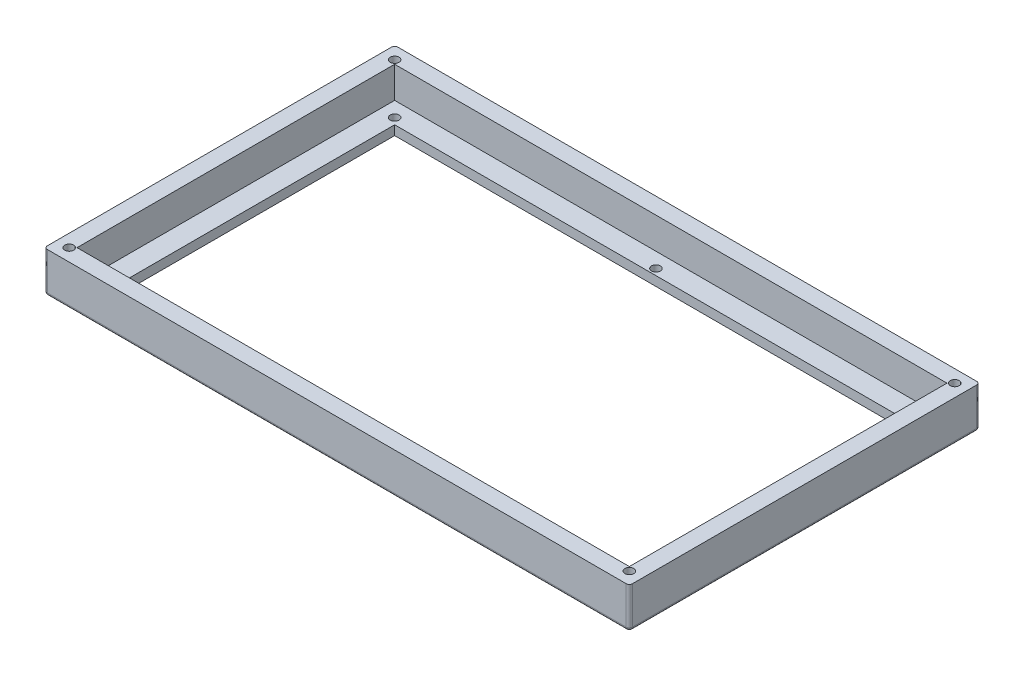
ISO-10303-21;
HEADER;
FILE_DESCRIPTION(('STEP AP214'),'2;1');
FILE_NAME('part.step','',(''),(''),'','','');
FILE_SCHEMA(('AUTOMOTIVE_DESIGN { 1 0 10303 214 1 1 1 1 }'));
ENDSEC;
DATA;
#1=APPLICATION_CONTEXT('core data for automotive mechanical design processes');
#2=APPLICATION_PROTOCOL_DEFINITION('international standard','automotive_design',2000,#1);
#3=PRODUCT_CONTEXT('',#1,'mechanical');
#4=PRODUCT('Part','Part','',(#3));
#5=PRODUCT_RELATED_PRODUCT_CATEGORY('part','',(#4));
#6=PRODUCT_DEFINITION_FORMATION('','',#4);
#7=PRODUCT_DEFINITION_CONTEXT('part definition',#1,'design');
#8=PRODUCT_DEFINITION('design','',#6,#7);
#9=PRODUCT_DEFINITION_SHAPE('','',#8);
#10=(LENGTH_UNIT() NAMED_UNIT(*) SI_UNIT(.MILLI.,.METRE.));
#11=(NAMED_UNIT(*) PLANE_ANGLE_UNIT() SI_UNIT($,.RADIAN.));
#12=(NAMED_UNIT(*) SI_UNIT($,.STERADIAN.) SOLID_ANGLE_UNIT());
#13=UNCERTAINTY_MEASURE_WITH_UNIT(LENGTH_MEASURE(1.E-05),#10,'distance_accuracy_value','');
#14=(GEOMETRIC_REPRESENTATION_CONTEXT(3) GLOBAL_UNCERTAINTY_ASSIGNED_CONTEXT((#13)) GLOBAL_UNIT_ASSIGNED_CONTEXT((#10,
#11,#12)) REPRESENTATION_CONTEXT('',''));
#15=CARTESIAN_POINT('',(0.,0.,0.));
#16=DIRECTION('',(0.,0.,1.));
#17=DIRECTION('',(1.,0.,0.));
#18=AXIS2_PLACEMENT_3D('',#15,#16,#17);
#19=CARTESIAN_POINT('',(0.,3.,0.));
#20=DIRECTION('',(0.,1.,0.));
#21=DIRECTION('',(0.,0.,1.));
#22=AXIS2_PLACEMENT_3D('',#19,#20,#21);
#23=PLANE('',#22);
#24=CARTESIAN_POINT('',(83.4999999999997,3.,-46.));
#25=DIRECTION('',(0.,1.,0.));
#26=DIRECTION('',(0.,0.,1.));
#27=AXIS2_PLACEMENT_3D('',#24,#25,#26);
#28=CIRCLE('',#27,1.425);
#29=CARTESIAN_POINT('',(83.4999999999997,3.,-44.575));
#30=VERTEX_POINT('',#29);
#31=EDGE_CURVE('E234',#30,#30,#28,.T.);
#32=ORIENTED_EDGE('',*,*,#31,.F.);
#33=EDGE_LOOP('',(#32));
#34=FACE_BOUND('',#33,.T.);
#35=CARTESIAN_POINT('',(83.5,3.,46.));
#36=DIRECTION('',(0.,1.,0.));
#37=DIRECTION('',(0.,0.,1.));
#38=AXIS2_PLACEMENT_3D('',#35,#36,#37);
#39=CIRCLE('',#38,1.425);
#40=CARTESIAN_POINT('',(83.5,3.,47.425));
#41=VERTEX_POINT('',#40);
#42=EDGE_CURVE('E246',#41,#41,#39,.T.);
#43=ORIENTED_EDGE('',*,*,#42,.F.);
#44=EDGE_LOOP('',(#43));
#45=FACE_BOUND('',#44,.T.);
#46=CARTESIAN_POINT('',(-83.5,3.,46.));
#47=DIRECTION('',(0.,1.,0.));
#48=DIRECTION('',(0.,0.,1.));
#49=AXIS2_PLACEMENT_3D('',#46,#47,#48);
#50=CIRCLE('',#49,1.425);
#51=CARTESIAN_POINT('',(-83.5,3.,47.425));
#52=VERTEX_POINT('',#51);
#53=EDGE_CURVE('E258',#52,#52,#50,.T.);
#54=ORIENTED_EDGE('',*,*,#53,.F.);
#55=EDGE_LOOP('',(#54));
#56=FACE_BOUND('',#55,.T.);
#57=DIRECTION('',(1.,0.,0.));
#58=VECTOR('',#57,1.);
#59=CARTESIAN_POINT('',(-81.5,3.,44.));
#60=LINE('',#59,#58);
#61=CARTESIAN_POINT('',(-81.5,3.,44.));
#62=VERTEX_POINT('',#61);
#63=CARTESIAN_POINT('',(81.5,3.,44.));
#64=VERTEX_POINT('',#63);
#65=EDGE_CURVE('E269',#62,#64,#60,.T.);
#66=ORIENTED_EDGE('',*,*,#65,.F.);
#67=DIRECTION('',(0.,0.,1.));
#68=VECTOR('',#67,1.);
#69=CARTESIAN_POINT('',(-81.5,3.,-44.));
#70=LINE('',#69,#68);
#71=CARTESIAN_POINT('',(-81.5,3.,-44.));
#72=VERTEX_POINT('',#71);
#73=EDGE_CURVE('E267',#72,#62,#70,.T.);
#74=ORIENTED_EDGE('',*,*,#73,.F.);
#75=DIRECTION('',(-1.,0.,0.));
#76=VECTOR('',#75,1.);
#77=CARTESIAN_POINT('',(-81.5,3.,-44.));
#78=LINE('',#77,#76);
#79=CARTESIAN_POINT('',(81.5,3.,-44.));
#80=VERTEX_POINT('',#79);
#81=EDGE_CURVE('E275',#80,#72,#78,.T.);
#82=ORIENTED_EDGE('',*,*,#81,.F.);
#83=DIRECTION('',(0.,0.,-1.));
#84=VECTOR('',#83,1.);
#85=CARTESIAN_POINT('',(81.5,3.,-44.));
#86=LINE('',#85,#84);
#87=EDGE_CURVE('E272',#64,#80,#86,.T.);
#88=ORIENTED_EDGE('',*,*,#87,.F.);
#89=EDGE_LOOP('',(#66,#74,#82,#88));
#90=FACE_BOUND('',#89,.T.);
#91=CARTESIAN_POINT('',(0.,3.,46.));
#92=DIRECTION('',(0.,1.,0.));
#93=DIRECTION('',(0.,0.,1.));
#94=AXIS2_PLACEMENT_3D('',#91,#92,#93);
#95=CIRCLE('',#94,1.425);
#96=CARTESIAN_POINT('',(0.,3.,47.425));
#97=VERTEX_POINT('',#96);
#98=EDGE_CURVE('E252',#97,#97,#95,.T.);
#99=ORIENTED_EDGE('',*,*,#98,.F.);
#100=EDGE_LOOP('',(#99));
#101=FACE_BOUND('',#100,.T.);
#102=CARTESIAN_POINT('',(-3.05311331771918E-13,3.,-46.));
#103=DIRECTION('',(0.,1.,0.));
#104=DIRECTION('',(0.,0.,1.));
#105=AXIS2_PLACEMENT_3D('',#102,#103,#104);
#106=CIRCLE('',#105,1.425);
#107=CARTESIAN_POINT('',(-3.05311331771918E-13,3.,-44.575));
#108=VERTEX_POINT('',#107);
#109=EDGE_CURVE('E240',#108,#108,#106,.T.);
#110=ORIENTED_EDGE('',*,*,#109,.F.);
#111=EDGE_LOOP('',(#110));
#112=FACE_BOUND('',#111,.T.);
#113=CARTESIAN_POINT('',(-83.5000000000003,3.,-46.));
#114=DIRECTION('',(0.,1.,0.));
#115=DIRECTION('',(0.,0.,1.));
#116=AXIS2_PLACEMENT_3D('',#113,#114,#115);
#117=CIRCLE('',#116,1.425);
#118=CARTESIAN_POINT('',(-83.5000000000003,3.,-44.575));
#119=VERTEX_POINT('',#118);
#120=EDGE_CURVE('E228',#119,#119,#117,.T.);
#121=ORIENTED_EDGE('',*,*,#120,.F.);
#122=EDGE_LOOP('',(#121));
#123=FACE_BOUND('',#122,.T.);
#124=DIRECTION('',(-1.,0.,0.));
#125=VECTOR('',#124,1.);
#126=CARTESIAN_POINT('',(-88.25,3.,-50.75));
#127=LINE('',#126,#125);
#128=CARTESIAN_POINT('',(88.25,3.,-50.75));
#129=VERTEX_POINT('',#128);
#130=CARTESIAN_POINT('',(-88.25,3.,-50.75));
#131=VERTEX_POINT('',#130);
#132=EDGE_CURVE('E173',#129,#131,#127,.T.);
#133=ORIENTED_EDGE('',*,*,#132,.T.);
#134=DIRECTION('',(0.,0.,1.));
#135=VECTOR('',#134,1.);
#136=CARTESIAN_POINT('',(-88.25,3.,-50.75));
#137=LINE('',#136,#135);
#138=CARTESIAN_POINT('',(-88.25,3.,50.75));
#139=VERTEX_POINT('',#138);
#140=EDGE_CURVE('E194',#131,#139,#137,.T.);
#141=ORIENTED_EDGE('',*,*,#140,.T.);
#142=DIRECTION('',(1.,0.,0.));
#143=VECTOR('',#142,1.);
#144=CARTESIAN_POINT('',(-88.25,3.,50.75));
#145=LINE('',#144,#143);
#146=CARTESIAN_POINT('',(88.25,3.,50.75));
#147=VERTEX_POINT('',#146);
#148=EDGE_CURVE('E179',#139,#147,#145,.T.);
#149=ORIENTED_EDGE('',*,*,#148,.T.);
#150=DIRECTION('',(0.,0.,-1.));
#151=VECTOR('',#150,1.);
#152=CARTESIAN_POINT('',(88.25,3.,-50.75));
#153=LINE('',#152,#151);
#154=EDGE_CURVE('E198',#147,#129,#153,.T.);
#155=ORIENTED_EDGE('',*,*,#154,.T.);
#156=EDGE_LOOP('',(#133,#141,#149,#155));
#157=FACE_BOUND('',#156,.T.);
#158=ADVANCED_FACE('F37',(#34,#45,#56,#90,#101,#112,#123,#157),#23,.T.);
#159=CARTESIAN_POINT('',(0.,0.,0.));
#160=DIRECTION('',(0.,1.,0.));
#161=DIRECTION('',(0.,0.,1.));
#162=AXIS2_PLACEMENT_3D('',#159,#160,#161);
#163=PLANE('',#162);
#164=DIRECTION('',(0.,0.,-1.));
#165=VECTOR('',#164,1.);
#166=CARTESIAN_POINT('',(92.5,0.,0.));
#167=LINE('',#166,#165);
#168=CARTESIAN_POINT('',(92.5,0.,-55.));
#169=VERTEX_POINT('',#168);
#170=CARTESIAN_POINT('',(92.5,0.,55.));
#171=VERTEX_POINT('',#170);
#172=EDGE_CURVE('E308',#169,#171,#167,.F.);
#173=ORIENTED_EDGE('',*,*,#172,.T.);
#174=DIRECTION('',(1.,0.,0.));
#175=VECTOR('',#174,1.);
#176=CARTESIAN_POINT('',(0.,0.,55.));
#177=LINE('',#176,#175);
#178=CARTESIAN_POINT('',(-92.5,0.,55.));
#179=VERTEX_POINT('',#178);
#180=EDGE_CURVE('E310',#171,#179,#177,.F.);
#181=ORIENTED_EDGE('',*,*,#180,.T.);
#182=DIRECTION('',(0.,0.,1.));
#183=VECTOR('',#182,1.);
#184=CARTESIAN_POINT('',(-92.5,0.,0.));
#185=LINE('',#184,#183);
#186=CARTESIAN_POINT('',(-92.5,0.,-55.));
#187=VERTEX_POINT('',#186);
#188=EDGE_CURVE('E304',#179,#187,#185,.F.);
#189=ORIENTED_EDGE('',*,*,#188,.T.);
#190=DIRECTION('',(-1.,0.,0.));
#191=VECTOR('',#190,1.);
#192=CARTESIAN_POINT('',(0.,0.,-55.));
#193=LINE('',#192,#191);
#194=EDGE_CURVE('E306',#187,#169,#193,.F.);
#195=ORIENTED_EDGE('',*,*,#194,.T.);
#196=EDGE_LOOP('',(#173,#181,#189,#195));
#197=FACE_BOUND('',#196,.T.);
#198=DIRECTION('',(0.,0.,1.));
#199=VECTOR('',#198,1.);
#200=CARTESIAN_POINT('',(-81.5,0.,-44.));
#201=LINE('',#200,#199);
#202=CARTESIAN_POINT('',(-81.5,0.,-44.));
#203=VERTEX_POINT('',#202);
#204=CARTESIAN_POINT('',(-81.5,0.,44.));
#205=VERTEX_POINT('',#204);
#206=EDGE_CURVE('E266',#203,#205,#201,.T.);
#207=ORIENTED_EDGE('',*,*,#206,.T.);
#208=DIRECTION('',(1.,0.,0.));
#209=VECTOR('',#208,1.);
#210=CARTESIAN_POINT('',(-81.5,0.,44.));
#211=LINE('',#210,#209);
#212=CARTESIAN_POINT('',(81.5,0.,44.));
#213=VERTEX_POINT('',#212);
#214=EDGE_CURVE('E280',#205,#213,#211,.T.);
#215=ORIENTED_EDGE('',*,*,#214,.T.);
#216=DIRECTION('',(0.,0.,-1.));
#217=VECTOR('',#216,1.);
#218=CARTESIAN_POINT('',(81.5,0.,-44.));
#219=LINE('',#218,#217);
#220=CARTESIAN_POINT('',(81.5,0.,-44.));
#221=VERTEX_POINT('',#220);
#222=EDGE_CURVE('E283',#213,#221,#219,.T.);
#223=ORIENTED_EDGE('',*,*,#222,.T.);
#224=DIRECTION('',(-1.,0.,0.));
#225=VECTOR('',#224,1.);
#226=CARTESIAN_POINT('',(-81.5,0.,-44.));
#227=LINE('',#226,#225);
#228=EDGE_CURVE('E270',#221,#203,#227,.T.);
#229=ORIENTED_EDGE('',*,*,#228,.T.);
#230=EDGE_LOOP('',(#207,#215,#223,#229));
#231=FACE_BOUND('',#230,.T.);
#232=CARTESIAN_POINT('',(-89.5,0.,52.));
#233=DIRECTION('',(0.,1.,0.));
#234=DIRECTION('',(0.,0.,1.));
#235=AXIS2_PLACEMENT_3D('',#232,#233,#234);
#236=CIRCLE('',#235,1.425);
#237=CARTESIAN_POINT('',(-89.5,0.,53.425));
#238=VERTEX_POINT('',#237);
#239=EDGE_CURVE('E261',#238,#238,#236,.T.);
#240=ORIENTED_EDGE('',*,*,#239,.T.);
#241=EDGE_LOOP('',(#240));
#242=FACE_BOUND('',#241,.T.);
#243=CARTESIAN_POINT('',(-83.5,0.,46.));
#244=DIRECTION('',(0.,1.,0.));
#245=DIRECTION('',(0.,0.,1.));
#246=AXIS2_PLACEMENT_3D('',#243,#244,#245);
#247=CIRCLE('',#246,1.425);
#248=CARTESIAN_POINT('',(-83.5,0.,47.425));
#249=VERTEX_POINT('',#248);
#250=EDGE_CURVE('E255',#249,#249,#247,.T.);
#251=ORIENTED_EDGE('',*,*,#250,.T.);
#252=EDGE_LOOP('',(#251));
#253=FACE_BOUND('',#252,.T.);
#254=CARTESIAN_POINT('',(0.,0.,46.));
#255=DIRECTION('',(0.,1.,0.));
#256=DIRECTION('',(0.,0.,1.));
#257=AXIS2_PLACEMENT_3D('',#254,#255,#256);
#258=CIRCLE('',#257,1.425);
#259=CARTESIAN_POINT('',(0.,0.,47.425));
#260=VERTEX_POINT('',#259);
#261=EDGE_CURVE('E249',#260,#260,#258,.T.);
#262=ORIENTED_EDGE('',*,*,#261,.T.);
#263=EDGE_LOOP('',(#262));
#264=FACE_BOUND('',#263,.T.);
#265=CARTESIAN_POINT('',(83.5,0.,46.));
#266=DIRECTION('',(0.,1.,0.));
#267=DIRECTION('',(0.,0.,1.));
#268=AXIS2_PLACEMENT_3D('',#265,#266,#267);
#269=CIRCLE('',#268,1.425);
#270=CARTESIAN_POINT('',(83.5,0.,47.425));
#271=VERTEX_POINT('',#270);
#272=EDGE_CURVE('E243',#271,#271,#269,.T.);
#273=ORIENTED_EDGE('',*,*,#272,.T.);
#274=EDGE_LOOP('',(#273));
#275=FACE_BOUND('',#274,.T.);
#276=CARTESIAN_POINT('',(-3.05311331771918E-13,0.,-46.));
#277=DIRECTION('',(0.,1.,0.));
#278=DIRECTION('',(0.,0.,1.));
#279=AXIS2_PLACEMENT_3D('',#276,#277,#278);
#280=CIRCLE('',#279,1.425);
#281=CARTESIAN_POINT('',(-3.05311331771918E-13,0.,-44.575));
#282=VERTEX_POINT('',#281);
#283=EDGE_CURVE('E237',#282,#282,#280,.T.);
#284=ORIENTED_EDGE('',*,*,#283,.T.);
#285=EDGE_LOOP('',(#284));
#286=FACE_BOUND('',#285,.T.);
#287=CARTESIAN_POINT('',(83.4999999999997,0.,-46.));
#288=DIRECTION('',(0.,1.,0.));
#289=DIRECTION('',(0.,0.,1.));
#290=AXIS2_PLACEMENT_3D('',#287,#288,#289);
#291=CIRCLE('',#290,1.425);
#292=CARTESIAN_POINT('',(83.4999999999997,0.,-44.575));
#293=VERTEX_POINT('',#292);
#294=EDGE_CURVE('E231',#293,#293,#291,.T.);
#295=ORIENTED_EDGE('',*,*,#294,.T.);
#296=EDGE_LOOP('',(#295));
#297=FACE_BOUND('',#296,.T.);
#298=CARTESIAN_POINT('',(-83.5000000000003,0.,-46.));
#299=DIRECTION('',(0.,1.,0.));
#300=DIRECTION('',(0.,0.,1.));
#301=AXIS2_PLACEMENT_3D('',#298,#299,#300);
#302=CIRCLE('',#301,1.425);
#303=CARTESIAN_POINT('',(-83.5000000000003,0.,-44.575));
#304=VERTEX_POINT('',#303);
#305=EDGE_CURVE('E227',#304,#304,#302,.T.);
#306=ORIENTED_EDGE('',*,*,#305,.T.);
#307=EDGE_LOOP('',(#306));
#308=FACE_BOUND('',#307,.T.);
#309=CARTESIAN_POINT('',(89.5,0.,52.));
#310=DIRECTION('',(0.,1.,0.));
#311=DIRECTION('',(0.,0.,1.));
#312=AXIS2_PLACEMENT_3D('',#309,#310,#311);
#313=CIRCLE('',#312,1.425);
#314=CARTESIAN_POINT('',(89.5,0.,53.425));
#315=VERTEX_POINT('',#314);
#316=EDGE_CURVE('E224',#315,#315,#313,.T.);
#317=ORIENTED_EDGE('',*,*,#316,.T.);
#318=EDGE_LOOP('',(#317));
#319=FACE_BOUND('',#318,.T.);
#320=CARTESIAN_POINT('',(89.4999999999996,0.,-52.));
#321=DIRECTION('',(0.,1.,0.));
#322=DIRECTION('',(0.,0.,1.));
#323=AXIS2_PLACEMENT_3D('',#320,#321,#322);
#324=CIRCLE('',#323,1.425);
#325=CARTESIAN_POINT('',(89.4999999999996,0.,-50.575));
#326=VERTEX_POINT('',#325);
#327=EDGE_CURVE('E221',#326,#326,#324,.T.);
#328=ORIENTED_EDGE('',*,*,#327,.T.);
#329=EDGE_LOOP('',(#328));
#330=FACE_BOUND('',#329,.T.);
#331=CARTESIAN_POINT('',(-89.5000000000003,0.,-52.));
#332=DIRECTION('',(0.,1.,0.));
#333=DIRECTION('',(0.,0.,1.));
#334=AXIS2_PLACEMENT_3D('',#331,#332,#333);
#335=CIRCLE('',#334,1.425);
#336=CARTESIAN_POINT('',(-89.5000000000003,0.,-50.575));
#337=VERTEX_POINT('',#336);
#338=EDGE_CURVE('E218',#337,#337,#335,.T.);
#339=ORIENTED_EDGE('',*,*,#338,.T.);
#340=EDGE_LOOP('',(#339));
#341=FACE_BOUND('',#340,.T.);
#342=ADVANCED_FACE('F430',(#197,#231,#242,#253,#264,#275,#286,#297,#308,#319,#330,#341),#163,.F.);
#343=CARTESIAN_POINT('',(-93.5,3.,-56.));
#344=DIRECTION('',(1.,0.,0.));
#345=DIRECTION('',(0.,0.,-1.));
#346=AXIS2_PLACEMENT_3D('',#343,#344,#345);
#347=PLANE('',#346);
#348=DIRECTION('',(0.,0.,1.));
#349=VECTOR('',#348,1.);
#350=CARTESIAN_POINT('',(-93.5,13.,-56.));
#351=LINE('',#350,#349);
#352=CARTESIAN_POINT('',(-93.5,13.,-55.));
#353=VERTEX_POINT('',#352);
#354=CARTESIAN_POINT('',(-93.5,13.,55.));
#355=VERTEX_POINT('',#354);
#356=EDGE_CURVE('E180',#353,#355,#351,.T.);
#357=ORIENTED_EDGE('',*,*,#356,.F.);
#358=DIRECTION('',(0.,-1.,0.));
#359=VECTOR('',#358,1.);
#360=CARTESIAN_POINT('',(-93.5,3.,-55.));
#361=LINE('',#360,#359);
#362=CARTESIAN_POINT('',(-93.5,1.,-55.));
#363=VERTEX_POINT('',#362);
#364=EDGE_CURVE('E11',#353,#363,#361,.T.);
#365=ORIENTED_EDGE('',*,*,#364,.T.);
#366=DIRECTION('',(0.,0.,1.));
#367=VECTOR('',#366,1.);
#368=CARTESIAN_POINT('',(-93.5,1.,-56.));
#369=LINE('',#368,#367);
#370=CARTESIAN_POINT('',(-93.5,1.,55.));
#371=VERTEX_POINT('',#370);
#372=EDGE_CURVE('E46',#363,#371,#369,.T.);
#373=ORIENTED_EDGE('',*,*,#372,.T.);
#374=DIRECTION('',(0.,-1.,0.));
#375=VECTOR('',#374,1.);
#376=CARTESIAN_POINT('',(-93.5,3.,55.));
#377=LINE('',#376,#375);
#378=EDGE_CURVE('E333',#371,#355,#377,.F.);
#379=ORIENTED_EDGE('',*,*,#378,.T.);
#380=EDGE_LOOP('',(#357,#365,#373,#379));
#381=FACE_BOUND('',#380,.T.);
#382=ADVANCED_FACE('F452',(#381),#347,.F.);
#383=CARTESIAN_POINT('',(-93.5,3.,56.));
#384=DIRECTION('',(0.,0.,-1.));
#385=DIRECTION('',(-1.,0.,0.));
#386=AXIS2_PLACEMENT_3D('',#383,#384,#385);
#387=PLANE('',#386);
#388=DIRECTION('',(1.,0.,0.));
#389=VECTOR('',#388,1.);
#390=CARTESIAN_POINT('',(-93.5,1.,56.));
#391=LINE('',#390,#389);
#392=CARTESIAN_POINT('',(-92.5,1.,56.));
#393=VERTEX_POINT('',#392);
#394=CARTESIAN_POINT('',(92.5,1.,56.));
#395=VERTEX_POINT('',#394);
#396=EDGE_CURVE('E299',#393,#395,#391,.T.);
#397=ORIENTED_EDGE('',*,*,#396,.T.);
#398=DIRECTION('',(0.,-1.,0.));
#399=VECTOR('',#398,1.);
#400=CARTESIAN_POINT('',(92.5,3.,56.));
#401=LINE('',#400,#399);
#402=CARTESIAN_POINT('',(92.5,13.,56.));
#403=VERTEX_POINT('',#402);
#404=EDGE_CURVE('E302',#395,#403,#401,.F.);
#405=ORIENTED_EDGE('',*,*,#404,.T.);
#406=DIRECTION('',(1.,0.,0.));
#407=VECTOR('',#406,1.);
#408=CARTESIAN_POINT('',(-93.5,13.,56.));
#409=LINE('',#408,#407);
#410=CARTESIAN_POINT('',(-92.5,13.,56.));
#411=VERTEX_POINT('',#410);
#412=EDGE_CURVE('E209',#411,#403,#409,.T.);
#413=ORIENTED_EDGE('',*,*,#412,.F.);
#414=DIRECTION('',(0.,-1.,0.));
#415=VECTOR('',#414,1.);
#416=CARTESIAN_POINT('',(-92.5,3.,56.));
#417=LINE('',#416,#415);
#418=EDGE_CURVE('E297',#411,#393,#417,.T.);
#419=ORIENTED_EDGE('',*,*,#418,.T.);
#420=EDGE_LOOP('',(#397,#405,#413,#419));
#421=FACE_BOUND('',#420,.T.);
#422=ADVANCED_FACE('F464',(#421),#387,.F.);
#423=CARTESIAN_POINT('',(93.5,3.,-56.));
#424=DIRECTION('',(-1.,0.,0.));
#425=DIRECTION('',(0.,0.,1.));
#426=AXIS2_PLACEMENT_3D('',#423,#424,#425);
#427=PLANE('',#426);
#428=DIRECTION('',(0.,0.,-1.));
#429=VECTOR('',#428,1.);
#430=CARTESIAN_POINT('',(93.5,13.,-56.));
#431=LINE('',#430,#429);
#432=CARTESIAN_POINT('',(93.5,13.,55.));
#433=VERTEX_POINT('',#432);
#434=CARTESIAN_POINT('',(93.5,13.,-55.));
#435=VERTEX_POINT('',#434);
#436=EDGE_CURVE('E212',#433,#435,#431,.T.);
#437=ORIENTED_EDGE('',*,*,#436,.F.);
#438=DIRECTION('',(0.,-1.,0.));
#439=VECTOR('',#438,1.);
#440=CARTESIAN_POINT('',(93.5,3.,55.));
#441=LINE('',#440,#439);
#442=CARTESIAN_POINT('',(93.5,1.,55.));
#443=VERTEX_POINT('',#442);
#444=EDGE_CURVE('E317',#433,#443,#441,.T.);
#445=ORIENTED_EDGE('',*,*,#444,.T.);
#446=DIRECTION('',(0.,0.,-1.));
#447=VECTOR('',#446,1.);
#448=CARTESIAN_POINT('',(93.5,1.,-56.));
#449=LINE('',#448,#447);
#450=CARTESIAN_POINT('',(93.5,1.,-55.));
#451=VERTEX_POINT('',#450);
#452=EDGE_CURVE('E315',#443,#451,#449,.T.);
#453=ORIENTED_EDGE('',*,*,#452,.T.);
#454=DIRECTION('',(0.,-1.,0.));
#455=VECTOR('',#454,1.);
#456=CARTESIAN_POINT('',(93.5,3.,-55.));
#457=LINE('',#456,#455);
#458=EDGE_CURVE('E313',#451,#435,#457,.F.);
#459=ORIENTED_EDGE('',*,*,#458,.T.);
#460=EDGE_LOOP('',(#437,#445,#453,#459));
#461=FACE_BOUND('',#460,.T.);
#462=ADVANCED_FACE('F403',(#461),#427,.F.);
#463=CARTESIAN_POINT('',(-93.5,3.,-56.));
#464=DIRECTION('',(0.,0.,1.));
#465=DIRECTION('',(1.,0.,0.));
#466=AXIS2_PLACEMENT_3D('',#463,#464,#465);
#467=PLANE('',#466);
#468=DIRECTION('',(-1.,0.,0.));
#469=VECTOR('',#468,1.);
#470=CARTESIAN_POINT('',(-93.5,13.,-56.));
#471=LINE('',#470,#469);
#472=CARTESIAN_POINT('',(92.5,13.,-56.));
#473=VERTEX_POINT('',#472);
#474=CARTESIAN_POINT('',(-92.5,13.,-56.));
#475=VERTEX_POINT('',#474);
#476=EDGE_CURVE('E215',#473,#475,#471,.T.);
#477=ORIENTED_EDGE('',*,*,#476,.F.);
#478=DIRECTION('',(0.,-1.,0.));
#479=VECTOR('',#478,1.);
#480=CARTESIAN_POINT('',(92.5,3.,-56.));
#481=LINE('',#480,#479);
#482=CARTESIAN_POINT('',(92.5,1.,-56.));
#483=VERTEX_POINT('',#482);
#484=EDGE_CURVE('E331',#473,#483,#481,.T.);
#485=ORIENTED_EDGE('',*,*,#484,.T.);
#486=DIRECTION('',(-1.,0.,0.));
#487=VECTOR('',#486,1.);
#488=CARTESIAN_POINT('',(-93.5,1.,-56.));
#489=LINE('',#488,#487);
#490=CARTESIAN_POINT('',(-92.5,1.,-56.));
#491=VERTEX_POINT('',#490);
#492=EDGE_CURVE('E329',#483,#491,#489,.T.);
#493=ORIENTED_EDGE('',*,*,#492,.T.);
#494=DIRECTION('',(0.,-1.,0.));
#495=VECTOR('',#494,1.);
#496=CARTESIAN_POINT('',(-92.5,3.,-56.));
#497=LINE('',#496,#495);
#498=EDGE_CURVE('E327',#491,#475,#497,.F.);
#499=ORIENTED_EDGE('',*,*,#498,.T.);
#500=EDGE_LOOP('',(#477,#485,#493,#499));
#501=FACE_BOUND('',#500,.T.);
#502=ADVANCED_FACE('F422',(#501),#467,.F.);
#503=CARTESIAN_POINT('',(-81.5,3.,-44.));
#504=DIRECTION('',(1.,0.,0.));
#505=DIRECTION('',(0.,0.,-1.));
#506=AXIS2_PLACEMENT_3D('',#503,#504,#505);
#507=PLANE('',#506);
#508=ORIENTED_EDGE('',*,*,#206,.F.);
#509=DIRECTION('',(0.,-1.,0.));
#510=VECTOR('',#509,1.);
#511=CARTESIAN_POINT('',(-81.5,3.,-44.));
#512=LINE('',#511,#510);
#513=EDGE_CURVE('E277',#72,#203,#512,.T.);
#514=ORIENTED_EDGE('',*,*,#513,.F.);
#515=ORIENTED_EDGE('',*,*,#73,.T.);
#516=DIRECTION('',(0.,-1.,0.));
#517=VECTOR('',#516,1.);
#518=CARTESIAN_POINT('',(-81.5,3.,44.));
#519=LINE('',#518,#517);
#520=EDGE_CURVE('E294',#62,#205,#519,.T.);
#521=ORIENTED_EDGE('',*,*,#520,.T.);
#522=EDGE_LOOP('',(#508,#514,#515,#521));
#523=FACE_BOUND('',#522,.T.);
#524=ADVANCED_FACE('F457',(#523),#507,.T.);
#525=CARTESIAN_POINT('',(-81.5,3.,44.));
#526=DIRECTION('',(0.,0.,-1.));
#527=DIRECTION('',(-1.,0.,0.));
#528=AXIS2_PLACEMENT_3D('',#525,#526,#527);
#529=PLANE('',#528);
#530=ORIENTED_EDGE('',*,*,#214,.F.);
#531=ORIENTED_EDGE('',*,*,#520,.F.);
#532=ORIENTED_EDGE('',*,*,#65,.T.);
#533=DIRECTION('',(0.,-1.,0.));
#534=VECTOR('',#533,1.);
#535=CARTESIAN_POINT('',(81.5,3.,44.));
#536=LINE('',#535,#534);
#537=EDGE_CURVE('E292',#64,#213,#536,.T.);
#538=ORIENTED_EDGE('',*,*,#537,.T.);
#539=EDGE_LOOP('',(#530,#531,#532,#538));
#540=FACE_BOUND('',#539,.T.);
#541=ADVANCED_FACE('F805',(#540),#529,.T.);
#542=CARTESIAN_POINT('',(81.5,3.,-44.));
#543=DIRECTION('',(-1.,0.,0.));
#544=DIRECTION('',(0.,0.,1.));
#545=AXIS2_PLACEMENT_3D('',#542,#543,#544);
#546=PLANE('',#545);
#547=ORIENTED_EDGE('',*,*,#222,.F.);
#548=ORIENTED_EDGE('',*,*,#537,.F.);
#549=ORIENTED_EDGE('',*,*,#87,.T.);
#550=DIRECTION('',(0.,-1.,0.));
#551=VECTOR('',#550,1.);
#552=CARTESIAN_POINT('',(81.5,3.,-44.));
#553=LINE('',#552,#551);
#554=EDGE_CURVE('E290',#80,#221,#553,.T.);
#555=ORIENTED_EDGE('',*,*,#554,.T.);
#556=EDGE_LOOP('',(#547,#548,#549,#555));
#557=FACE_BOUND('',#556,.T.);
#558=ADVANCED_FACE('F795',(#557),#546,.T.);
#559=CARTESIAN_POINT('',(-81.5,3.,-44.));
#560=DIRECTION('',(0.,0.,1.));
#561=DIRECTION('',(1.,0.,0.));
#562=AXIS2_PLACEMENT_3D('',#559,#560,#561);
#563=PLANE('',#562);
#564=ORIENTED_EDGE('',*,*,#228,.F.);
#565=ORIENTED_EDGE('',*,*,#554,.F.);
#566=ORIENTED_EDGE('',*,*,#81,.T.);
#567=ORIENTED_EDGE('',*,*,#513,.T.);
#568=EDGE_LOOP('',(#564,#565,#566,#567));
#569=FACE_BOUND('',#568,.T.);
#570=ADVANCED_FACE('F680',(#569),#563,.T.);
#571=CARTESIAN_POINT('',(-89.5,3.,52.));
#572=DIRECTION('',(0.,-1.,0.));
#573=DIRECTION('',(0.,0.,-1.));
#574=AXIS2_PLACEMENT_3D('',#571,#572,#573);
#575=CYLINDRICAL_SURFACE('',#574,1.425);
#576=ORIENTED_EDGE('',*,*,#239,.F.);
#577=EDGE_LOOP('',(#576));
#578=FACE_BOUND('',#577,.T.);
#579=CARTESIAN_POINT('',(-89.5,13.,52.));
#580=DIRECTION('',(0.,1.,0.));
#581=DIRECTION('',(0.,0.,1.));
#582=AXIS2_PLACEMENT_3D('',#579,#580,#581);
#583=CIRCLE('',#582,1.425);
#584=CARTESIAN_POINT('',(-89.5,13.,53.425));
#585=VERTEX_POINT('',#584);
#586=EDGE_CURVE('E196',#585,#585,#583,.T.);
#587=ORIENTED_EDGE('',*,*,#586,.T.);
#588=EDGE_LOOP('',(#587));
#589=FACE_BOUND('',#588,.T.);
#590=ADVANCED_FACE('F383',(#578,#589),#575,.F.);
#591=CARTESIAN_POINT('',(-83.5,3.,46.));
#592=DIRECTION('',(0.,-1.,0.));
#593=DIRECTION('',(0.,0.,-1.));
#594=AXIS2_PLACEMENT_3D('',#591,#592,#593);
#595=CYLINDRICAL_SURFACE('',#594,1.425);
#596=ORIENTED_EDGE('',*,*,#53,.T.);
#597=EDGE_LOOP('',(#596));
#598=FACE_BOUND('',#597,.T.);
#599=ORIENTED_EDGE('',*,*,#250,.F.);
#600=EDGE_LOOP('',(#599));
#601=FACE_BOUND('',#600,.T.);
#602=ADVANCED_FACE('F679',(#598,#601),#595,.F.);
#603=CARTESIAN_POINT('',(0.,3.,46.));
#604=DIRECTION('',(0.,-1.,0.));
#605=DIRECTION('',(0.,0.,-1.));
#606=AXIS2_PLACEMENT_3D('',#603,#604,#605);
#607=CYLINDRICAL_SURFACE('',#606,1.425);
#608=ORIENTED_EDGE('',*,*,#98,.T.);
#609=EDGE_LOOP('',(#608));
#610=FACE_BOUND('',#609,.T.);
#611=ORIENTED_EDGE('',*,*,#261,.F.);
#612=EDGE_LOOP('',(#611));
#613=FACE_BOUND('',#612,.T.);
#614=ADVANCED_FACE('F768',(#610,#613),#607,.F.);
#615=CARTESIAN_POINT('',(83.5,3.,46.));
#616=DIRECTION('',(0.,-1.,0.));
#617=DIRECTION('',(0.,0.,-1.));
#618=AXIS2_PLACEMENT_3D('',#615,#616,#617);
#619=CYLINDRICAL_SURFACE('',#618,1.425);
#620=ORIENTED_EDGE('',*,*,#42,.T.);
#621=EDGE_LOOP('',(#620));
#622=FACE_BOUND('',#621,.T.);
#623=ORIENTED_EDGE('',*,*,#272,.F.);
#624=EDGE_LOOP('',(#623));
#625=FACE_BOUND('',#624,.T.);
#626=ADVANCED_FACE('F758',(#622,#625),#619,.F.);
#627=CARTESIAN_POINT('',(-3.05311331771918E-13,3.,-46.));
#628=DIRECTION('',(0.,-1.,0.));
#629=DIRECTION('',(0.,0.,-1.));
#630=AXIS2_PLACEMENT_3D('',#627,#628,#629);
#631=CYLINDRICAL_SURFACE('',#630,1.425);
#632=ORIENTED_EDGE('',*,*,#109,.T.);
#633=EDGE_LOOP('',(#632));
#634=FACE_BOUND('',#633,.T.);
#635=ORIENTED_EDGE('',*,*,#283,.F.);
#636=EDGE_LOOP('',(#635));
#637=FACE_BOUND('',#636,.T.);
#638=ADVANCED_FACE('F748',(#634,#637),#631,.F.);
#639=CARTESIAN_POINT('',(83.4999999999997,3.,-46.));
#640=DIRECTION('',(0.,-1.,0.));
#641=DIRECTION('',(0.,0.,-1.));
#642=AXIS2_PLACEMENT_3D('',#639,#640,#641);
#643=CYLINDRICAL_SURFACE('',#642,1.425);
#644=ORIENTED_EDGE('',*,*,#31,.T.);
#645=EDGE_LOOP('',(#644));
#646=FACE_BOUND('',#645,.T.);
#647=ORIENTED_EDGE('',*,*,#294,.F.);
#648=EDGE_LOOP('',(#647));
#649=FACE_BOUND('',#648,.T.);
#650=ADVANCED_FACE('F739',(#646,#649),#643,.F.);
#651=CARTESIAN_POINT('',(-83.5000000000003,3.,-46.));
#652=DIRECTION('',(0.,-1.,0.));
#653=DIRECTION('',(0.,0.,-1.));
#654=AXIS2_PLACEMENT_3D('',#651,#652,#653);
#655=CYLINDRICAL_SURFACE('',#654,1.425);
#656=ORIENTED_EDGE('',*,*,#120,.T.);
#657=EDGE_LOOP('',(#656));
#658=FACE_BOUND('',#657,.T.);
#659=ORIENTED_EDGE('',*,*,#305,.F.);
#660=EDGE_LOOP('',(#659));
#661=FACE_BOUND('',#660,.T.);
#662=ADVANCED_FACE('F665',(#658,#661),#655,.F.);
#663=CARTESIAN_POINT('',(89.5,3.,52.));
#664=DIRECTION('',(0.,-1.,0.));
#665=DIRECTION('',(0.,0.,-1.));
#666=AXIS2_PLACEMENT_3D('',#663,#664,#665);
#667=CYLINDRICAL_SURFACE('',#666,1.425);
#668=ORIENTED_EDGE('',*,*,#316,.F.);
#669=EDGE_LOOP('',(#668));
#670=FACE_BOUND('',#669,.T.);
#671=CARTESIAN_POINT('',(89.5,13.,52.));
#672=DIRECTION('',(0.,1.,0.));
#673=DIRECTION('',(0.,0.,1.));
#674=AXIS2_PLACEMENT_3D('',#671,#672,#673);
#675=CIRCLE('',#674,1.425);
#676=CARTESIAN_POINT('',(89.5,13.,53.425));
#677=VERTEX_POINT('',#676);
#678=EDGE_CURVE('E376',#677,#677,#675,.T.);
#679=ORIENTED_EDGE('',*,*,#678,.T.);
#680=EDGE_LOOP('',(#679));
#681=FACE_BOUND('',#680,.T.);
#682=ADVANCED_FACE('F652',(#670,#681),#667,.F.);
#683=CARTESIAN_POINT('',(89.4999999999996,3.,-52.));
#684=DIRECTION('',(0.,-1.,0.));
#685=DIRECTION('',(0.,0.,-1.));
#686=AXIS2_PLACEMENT_3D('',#683,#684,#685);
#687=CYLINDRICAL_SURFACE('',#686,1.425);
#688=ORIENTED_EDGE('',*,*,#327,.F.);
#689=EDGE_LOOP('',(#688));
#690=FACE_BOUND('',#689,.T.);
#691=CARTESIAN_POINT('',(89.4999999999996,13.,-52.));
#692=DIRECTION('',(0.,1.,0.));
#693=DIRECTION('',(0.,0.,1.));
#694=AXIS2_PLACEMENT_3D('',#691,#692,#693);
#695=CIRCLE('',#694,1.425);
#696=CARTESIAN_POINT('',(89.4999999999996,13.,-50.575));
#697=VERTEX_POINT('',#696);
#698=EDGE_CURVE('E371',#697,#697,#695,.T.);
#699=ORIENTED_EDGE('',*,*,#698,.T.);
#700=EDGE_LOOP('',(#699));
#701=FACE_BOUND('',#700,.T.);
#702=ADVANCED_FACE('F638',(#690,#701),#687,.F.);
#703=CARTESIAN_POINT('',(-89.5000000000003,3.,-52.));
#704=DIRECTION('',(0.,-1.,0.));
#705=DIRECTION('',(0.,0.,-1.));
#706=AXIS2_PLACEMENT_3D('',#703,#704,#705);
#707=CYLINDRICAL_SURFACE('',#706,1.425);
#708=ORIENTED_EDGE('',*,*,#338,.F.);
#709=EDGE_LOOP('',(#708));
#710=FACE_BOUND('',#709,.T.);
#711=CARTESIAN_POINT('',(-89.5000000000003,13.,-52.));
#712=DIRECTION('',(0.,1.,0.));
#713=DIRECTION('',(0.,0.,1.));
#714=AXIS2_PLACEMENT_3D('',#711,#712,#713);
#715=CIRCLE('',#714,1.425);
#716=CARTESIAN_POINT('',(-89.5000000000003,13.,-50.575));
#717=VERTEX_POINT('',#716);
#718=EDGE_CURVE('E368',#717,#717,#715,.T.);
#719=ORIENTED_EDGE('',*,*,#718,.T.);
#720=EDGE_LOOP('',(#719));
#721=FACE_BOUND('',#720,.T.);
#722=ADVANCED_FACE('F387',(#710,#721),#707,.F.);
#723=CARTESIAN_POINT('',(0.,13.,0.));
#724=DIRECTION('',(0.,1.,0.));
#725=DIRECTION('',(0.,0.,1.));
#726=AXIS2_PLACEMENT_3D('',#723,#724,#725);
#727=PLANE('',#726);
#728=ORIENTED_EDGE('',*,*,#698,.F.);
#729=EDGE_LOOP('',(#728));
#730=FACE_BOUND('',#729,.T.);
#731=ORIENTED_EDGE('',*,*,#586,.F.);
#732=EDGE_LOOP('',(#731));
#733=FACE_BOUND('',#732,.T.);
#734=ORIENTED_EDGE('',*,*,#412,.T.);
#735=CARTESIAN_POINT('',(92.5,13.,55.));
#736=DIRECTION('',(0.,1.,0.));
#737=DIRECTION('',(0.,0.,1.));
#738=AXIS2_PLACEMENT_3D('',#735,#736,#737);
#739=CIRCLE('',#738,1.);
#740=EDGE_CURVE('E325',#403,#433,#739,.T.);
#741=ORIENTED_EDGE('',*,*,#740,.T.);
#742=ORIENTED_EDGE('',*,*,#436,.T.);
#743=CARTESIAN_POINT('',(92.5,13.,-55.));
#744=DIRECTION('',(0.,1.,0.));
#745=DIRECTION('',(0.,0.,1.));
#746=AXIS2_PLACEMENT_3D('',#743,#744,#745);
#747=CIRCLE('',#746,1.);
#748=EDGE_CURVE('E323',#435,#473,#747,.T.);
#749=ORIENTED_EDGE('',*,*,#748,.T.);
#750=ORIENTED_EDGE('',*,*,#476,.T.);
#751=CARTESIAN_POINT('',(-92.5,13.,-55.));
#752=DIRECTION('',(0.,1.,0.));
#753=DIRECTION('',(0.,0.,1.));
#754=AXIS2_PLACEMENT_3D('',#751,#752,#753);
#755=CIRCLE('',#754,1.);
#756=EDGE_CURVE('E321',#475,#353,#755,.T.);
#757=ORIENTED_EDGE('',*,*,#756,.T.);
#758=ORIENTED_EDGE('',*,*,#356,.T.);
#759=CARTESIAN_POINT('',(-92.5,13.,55.));
#760=DIRECTION('',(0.,1.,0.));
#761=DIRECTION('',(0.,0.,1.));
#762=AXIS2_PLACEMENT_3D('',#759,#760,#761);
#763=CIRCLE('',#762,1.);
#764=EDGE_CURVE('E319',#355,#411,#763,.T.);
#765=ORIENTED_EDGE('',*,*,#764,.T.);
#766=EDGE_LOOP('',(#734,#741,#742,#749,#750,#757,#758,#765));
#767=FACE_BOUND('',#766,.T.);
#768=DIRECTION('',(1.,0.,0.));
#769=VECTOR('',#768,1.);
#770=CARTESIAN_POINT('',(-88.25,13.,50.75));
#771=LINE('',#770,#769);
#772=CARTESIAN_POINT('',(-88.25,13.,50.75));
#773=VERTEX_POINT('',#772);
#774=CARTESIAN_POINT('',(88.25,13.,50.75));
#775=VERTEX_POINT('',#774);
#776=EDGE_CURVE('E172',#773,#775,#771,.T.);
#777=ORIENTED_EDGE('',*,*,#776,.F.);
#778=DIRECTION('',(0.,0.,1.));
#779=VECTOR('',#778,1.);
#780=CARTESIAN_POINT('',(-88.25,13.,-50.75));
#781=LINE('',#780,#779);
#782=CARTESIAN_POINT('',(-88.25,13.,-50.75));
#783=VERTEX_POINT('',#782);
#784=EDGE_CURVE('E162',#783,#773,#781,.T.);
#785=ORIENTED_EDGE('',*,*,#784,.F.);
#786=DIRECTION('',(-1.,0.,0.));
#787=VECTOR('',#786,1.);
#788=CARTESIAN_POINT('',(-88.25,13.,-50.75));
#789=LINE('',#788,#787);
#790=CARTESIAN_POINT('',(88.25,13.,-50.75));
#791=VERTEX_POINT('',#790);
#792=EDGE_CURVE('E189',#791,#783,#789,.T.);
#793=ORIENTED_EDGE('',*,*,#792,.F.);
#794=DIRECTION('',(0.,0.,-1.));
#795=VECTOR('',#794,1.);
#796=CARTESIAN_POINT('',(88.25,13.,-50.75));
#797=LINE('',#796,#795);
#798=EDGE_CURVE('E187',#775,#791,#797,.T.);
#799=ORIENTED_EDGE('',*,*,#798,.F.);
#800=EDGE_LOOP('',(#777,#785,#793,#799));
#801=FACE_BOUND('',#800,.T.);
#802=ORIENTED_EDGE('',*,*,#678,.F.);
#803=EDGE_LOOP('',(#802));
#804=FACE_BOUND('',#803,.T.);
#805=ORIENTED_EDGE('',*,*,#718,.F.);
#806=EDGE_LOOP('',(#805));
#807=FACE_BOUND('',#806,.T.);
#808=ADVANCED_FACE('F184',(#730,#733,#767,#801,#804,#807),#727,.T.);
#809=CARTESIAN_POINT('',(-88.25,13.,-50.75));
#810=DIRECTION('',(1.,0.,0.));
#811=DIRECTION('',(0.,0.,-1.));
#812=AXIS2_PLACEMENT_3D('',#809,#810,#811);
#813=PLANE('',#812);
#814=ORIENTED_EDGE('',*,*,#140,.F.);
#815=DIRECTION('',(0.,-1.,0.));
#816=VECTOR('',#815,1.);
#817=CARTESIAN_POINT('',(-88.25,13.,-50.75));
#818=LINE('',#817,#816);
#819=EDGE_CURVE('E168',#783,#131,#818,.T.);
#820=ORIENTED_EDGE('',*,*,#819,.F.);
#821=ORIENTED_EDGE('',*,*,#784,.T.);
#822=DIRECTION('',(0.,-1.,0.));
#823=VECTOR('',#822,1.);
#824=CARTESIAN_POINT('',(-88.25,13.,50.75));
#825=LINE('',#824,#823);
#826=EDGE_CURVE('E166',#773,#139,#825,.T.);
#827=ORIENTED_EDGE('',*,*,#826,.T.);
#828=EDGE_LOOP('',(#814,#820,#821,#827));
#829=FACE_BOUND('',#828,.T.);
#830=ADVANCED_FACE('F165',(#829),#813,.T.);
#831=CARTESIAN_POINT('',(-88.25,13.,50.75));
#832=DIRECTION('',(0.,0.,-1.));
#833=DIRECTION('',(-1.,0.,0.));
#834=AXIS2_PLACEMENT_3D('',#831,#832,#833);
#835=PLANE('',#834);
#836=ORIENTED_EDGE('',*,*,#148,.F.);
#837=ORIENTED_EDGE('',*,*,#826,.F.);
#838=ORIENTED_EDGE('',*,*,#776,.T.);
#839=DIRECTION('',(0.,-1.,0.));
#840=VECTOR('',#839,1.);
#841=CARTESIAN_POINT('',(88.25,13.,50.75));
#842=LINE('',#841,#840);
#843=EDGE_CURVE('E181',#775,#147,#842,.T.);
#844=ORIENTED_EDGE('',*,*,#843,.T.);
#845=EDGE_LOOP('',(#836,#837,#838,#844));
#846=FACE_BOUND('',#845,.T.);
#847=ADVANCED_FACE('F176',(#846),#835,.T.);
#848=CARTESIAN_POINT('',(88.25,13.,-50.75));
#849=DIRECTION('',(-1.,0.,0.));
#850=DIRECTION('',(0.,0.,1.));
#851=AXIS2_PLACEMENT_3D('',#848,#849,#850);
#852=PLANE('',#851);
#853=ORIENTED_EDGE('',*,*,#154,.F.);
#854=ORIENTED_EDGE('',*,*,#843,.F.);
#855=ORIENTED_EDGE('',*,*,#798,.T.);
#856=DIRECTION('',(0.,-1.,0.));
#857=VECTOR('',#856,1.);
#858=CARTESIAN_POINT('',(88.25,13.,-50.75));
#859=LINE('',#858,#857);
#860=EDGE_CURVE('E204',#791,#129,#859,.T.);
#861=ORIENTED_EDGE('',*,*,#860,.T.);
#862=EDGE_LOOP('',(#853,#854,#855,#861));
#863=FACE_BOUND('',#862,.T.);
#864=ADVANCED_FACE('F591',(#863),#852,.T.);
#865=CARTESIAN_POINT('',(-88.25,13.,-50.75));
#866=DIRECTION('',(0.,0.,1.));
#867=DIRECTION('',(1.,0.,0.));
#868=AXIS2_PLACEMENT_3D('',#865,#866,#867);
#869=PLANE('',#868);
#870=ORIENTED_EDGE('',*,*,#132,.F.);
#871=ORIENTED_EDGE('',*,*,#860,.F.);
#872=ORIENTED_EDGE('',*,*,#792,.T.);
#873=ORIENTED_EDGE('',*,*,#819,.T.);
#874=EDGE_LOOP('',(#870,#871,#872,#873));
#875=FACE_BOUND('',#874,.T.);
#876=ADVANCED_FACE('F582',(#875),#869,.T.);
#877=CARTESIAN_POINT('',(-92.5,3.,-55.));
#878=DIRECTION('',(0.,-1.,0.));
#879=DIRECTION('',(0.,0.,-1.));
#880=AXIS2_PLACEMENT_3D('',#877,#878,#879);
#881=CYLINDRICAL_SURFACE('',#880,1.);
#882=ORIENTED_EDGE('',*,*,#756,.F.);
#883=ORIENTED_EDGE('',*,*,#498,.F.);
#884=CARTESIAN_POINT('',(-92.5,1.,-55.));
#885=DIRECTION('',(0.,-1.,0.));
#886=DIRECTION('',(0.,0.,-1.));
#887=AXIS2_PLACEMENT_3D('',#884,#885,#886);
#888=CIRCLE('',#887,1.);
#889=EDGE_CURVE('E363',#363,#491,#888,.T.);
#890=ORIENTED_EDGE('',*,*,#889,.F.);
#891=ORIENTED_EDGE('',*,*,#364,.F.);
#892=EDGE_LOOP('',(#882,#883,#890,#891));
#893=FACE_BOUND('',#892,.T.);
#894=ADVANCED_FACE('F39',(#893),#881,.T.);
#895=CARTESIAN_POINT('',(92.5,3.,-55.));
#896=DIRECTION('',(0.,-1.,0.));
#897=DIRECTION('',(0.,0.,-1.));
#898=AXIS2_PLACEMENT_3D('',#895,#896,#897);
#899=CYLINDRICAL_SURFACE('',#898,1.);
#900=ORIENTED_EDGE('',*,*,#748,.F.);
#901=ORIENTED_EDGE('',*,*,#458,.F.);
#902=CARTESIAN_POINT('',(92.5,1.,-55.));
#903=DIRECTION('',(0.,-1.,0.));
#904=DIRECTION('',(0.,0.,-1.));
#905=AXIS2_PLACEMENT_3D('',#902,#903,#904);
#906=CIRCLE('',#905,1.);
#907=EDGE_CURVE('E361',#483,#451,#906,.T.);
#908=ORIENTED_EDGE('',*,*,#907,.F.);
#909=ORIENTED_EDGE('',*,*,#484,.F.);
#910=EDGE_LOOP('',(#900,#901,#908,#909));
#911=FACE_BOUND('',#910,.T.);
#912=ADVANCED_FACE('F418',(#911),#899,.T.);
#913=CARTESIAN_POINT('',(-93.5,1.,-55.));
#914=DIRECTION('',(-1.,0.,0.));
#915=DIRECTION('',(0.,0.,1.));
#916=AXIS2_PLACEMENT_3D('',#913,#914,#915);
#917=CYLINDRICAL_SURFACE('',#916,1.);
#918=CARTESIAN_POINT('',(-92.5,1.,-55.));
#919=DIRECTION('',(-1.,0.,0.));
#920=DIRECTION('',(0.,0.,1.));
#921=AXIS2_PLACEMENT_3D('',#918,#919,#920);
#922=CIRCLE('',#921,1.);
#923=EDGE_CURVE('E41',#491,#187,#922,.T.);
#924=ORIENTED_EDGE('',*,*,#923,.F.);
#925=ORIENTED_EDGE('',*,*,#492,.F.);
#926=CARTESIAN_POINT('',(92.5,1.,-55.));
#927=DIRECTION('',(1.,0.,0.));
#928=DIRECTION('',(0.,0.,-1.));
#929=AXIS2_PLACEMENT_3D('',#926,#927,#928);
#930=CIRCLE('',#929,1.);
#931=EDGE_CURVE('E358',#169,#483,#930,.T.);
#932=ORIENTED_EDGE('',*,*,#931,.F.);
#933=ORIENTED_EDGE('',*,*,#194,.F.);
#934=EDGE_LOOP('',(#924,#925,#932,#933));
#935=FACE_BOUND('',#934,.T.);
#936=ADVANCED_FACE('F428',(#935),#917,.T.);
#937=CARTESIAN_POINT('',(-92.5,1.,-55.));
#938=DIRECTION('',(0.,0.,-1.));
#939=DIRECTION('',(-1.,0.,0.));
#940=AXIS2_PLACEMENT_3D('',#937,#938,#939);
#941=SPHERICAL_SURFACE('',#940,1.);
#942=ORIENTED_EDGE('',*,*,#889,.T.);
#943=ORIENTED_EDGE('',*,*,#923,.T.);
#944=CARTESIAN_POINT('',(-92.5,1.,-55.));
#945=DIRECTION('',(0.,0.,-1.));
#946=DIRECTION('',(-1.,0.,0.));
#947=AXIS2_PLACEMENT_3D('',#944,#945,#946);
#948=CIRCLE('',#947,1.);
#949=EDGE_CURVE('E355',#363,#187,#948,.F.);
#950=ORIENTED_EDGE('',*,*,#949,.F.);
#951=EDGE_LOOP('',(#942,#943,#950));
#952=FACE_BOUND('',#951,.T.);
#953=ADVANCED_FACE('F436',(#952),#941,.T.);
#954=CARTESIAN_POINT('',(92.5,1.,-55.));
#955=DIRECTION('',(0.,0.,-1.));
#956=DIRECTION('',(-1.,0.,0.));
#957=AXIS2_PLACEMENT_3D('',#954,#955,#956);
#958=SPHERICAL_SURFACE('',#957,1.);
#959=ORIENTED_EDGE('',*,*,#931,.T.);
#960=ORIENTED_EDGE('',*,*,#907,.T.);
#961=CARTESIAN_POINT('',(92.5,1.,-55.));
#962=DIRECTION('',(0.,0.,-1.));
#963=DIRECTION('',(-1.,0.,0.));
#964=AXIS2_PLACEMENT_3D('',#961,#962,#963);
#965=CIRCLE('',#964,1.);
#966=EDGE_CURVE('E352',#169,#451,#965,.F.);
#967=ORIENTED_EDGE('',*,*,#966,.F.);
#968=EDGE_LOOP('',(#959,#960,#967));
#969=FACE_BOUND('',#968,.T.);
#970=ADVANCED_FACE('F412',(#969),#958,.T.);
#971=CARTESIAN_POINT('',(-92.5,1.,-56.));
#972=DIRECTION('',(0.,0.,1.));
#973=DIRECTION('',(1.,0.,0.));
#974=AXIS2_PLACEMENT_3D('',#971,#972,#973);
#975=CYLINDRICAL_SURFACE('',#974,1.);
#976=ORIENTED_EDGE('',*,*,#949,.T.);
#977=ORIENTED_EDGE('',*,*,#188,.F.);
#978=CARTESIAN_POINT('',(-92.5,1.,55.));
#979=DIRECTION('',(0.,0.,1.));
#980=DIRECTION('',(1.,0.,0.));
#981=AXIS2_PLACEMENT_3D('',#978,#979,#980);
#982=CIRCLE('',#981,1.);
#983=EDGE_CURVE('E349',#371,#179,#982,.T.);
#984=ORIENTED_EDGE('',*,*,#983,.F.);
#985=ORIENTED_EDGE('',*,*,#372,.F.);
#986=EDGE_LOOP('',(#976,#977,#984,#985));
#987=FACE_BOUND('',#986,.T.);
#988=ADVANCED_FACE('F435',(#987),#975,.T.);
#989=CARTESIAN_POINT('',(-92.5,3.,55.));
#990=DIRECTION('',(0.,-1.,0.));
#991=DIRECTION('',(0.,0.,-1.));
#992=AXIS2_PLACEMENT_3D('',#989,#990,#991);
#993=CYLINDRICAL_SURFACE('',#992,1.);
#994=ORIENTED_EDGE('',*,*,#764,.F.);
#995=ORIENTED_EDGE('',*,*,#378,.F.);
#996=CARTESIAN_POINT('',(-92.5,1.,55.));
#997=DIRECTION('',(0.,-1.,0.));
#998=DIRECTION('',(0.,0.,-1.));
#999=AXIS2_PLACEMENT_3D('',#996,#997,#998);
#1000=CIRCLE('',#999,1.);
#1001=EDGE_CURVE('E346',#393,#371,#1000,.T.);
#1002=ORIENTED_EDGE('',*,*,#1001,.F.);
#1003=ORIENTED_EDGE('',*,*,#418,.F.);
#1004=EDGE_LOOP('',(#994,#995,#1002,#1003));
#1005=FACE_BOUND('',#1004,.T.);
#1006=ADVANCED_FACE('F485',(#1005),#993,.T.);
#1007=CARTESIAN_POINT('',(92.5,3.,55.));
#1008=DIRECTION('',(0.,-1.,0.));
#1009=DIRECTION('',(0.,0.,-1.));
#1010=AXIS2_PLACEMENT_3D('',#1007,#1008,#1009);
#1011=CYLINDRICAL_SURFACE('',#1010,1.);
#1012=ORIENTED_EDGE('',*,*,#740,.F.);
#1013=ORIENTED_EDGE('',*,*,#404,.F.);
#1014=CARTESIAN_POINT('',(92.5,1.,55.));
#1015=DIRECTION('',(0.,-1.,0.));
#1016=DIRECTION('',(0.,0.,-1.));
#1017=AXIS2_PLACEMENT_3D('',#1014,#1015,#1016);
#1018=CIRCLE('',#1017,1.);
#1019=EDGE_CURVE('E343',#443,#395,#1018,.T.);
#1020=ORIENTED_EDGE('',*,*,#1019,.F.);
#1021=ORIENTED_EDGE('',*,*,#444,.F.);
#1022=EDGE_LOOP('',(#1012,#1013,#1020,#1021));
#1023=FACE_BOUND('',#1022,.T.);
#1024=ADVANCED_FACE('F399',(#1023),#1011,.T.);
#1025=CARTESIAN_POINT('',(92.5,1.,-56.));
#1026=DIRECTION('',(0.,0.,-1.));
#1027=DIRECTION('',(-1.,0.,0.));
#1028=AXIS2_PLACEMENT_3D('',#1025,#1026,#1027);
#1029=CYLINDRICAL_SURFACE('',#1028,1.);
#1030=ORIENTED_EDGE('',*,*,#966,.T.);
#1031=ORIENTED_EDGE('',*,*,#452,.F.);
#1032=CARTESIAN_POINT('',(92.5,1.,55.));
#1033=DIRECTION('',(0.,0.,1.));
#1034=DIRECTION('',(1.,0.,0.));
#1035=AXIS2_PLACEMENT_3D('',#1032,#1033,#1034);
#1036=CIRCLE('',#1035,1.);
#1037=EDGE_CURVE('E340',#171,#443,#1036,.T.);
#1038=ORIENTED_EDGE('',*,*,#1037,.F.);
#1039=ORIENTED_EDGE('',*,*,#172,.F.);
#1040=EDGE_LOOP('',(#1030,#1031,#1038,#1039));
#1041=FACE_BOUND('',#1040,.T.);
#1042=ADVANCED_FACE('F407',(#1041),#1029,.T.);
#1043=CARTESIAN_POINT('',(-92.5,1.,55.));
#1044=DIRECTION('',(-1.,0.,0.));
#1045=DIRECTION('',(0.,0.,1.));
#1046=AXIS2_PLACEMENT_3D('',#1043,#1044,#1045);
#1047=SPHERICAL_SURFACE('',#1046,1.);
#1048=ORIENTED_EDGE('',*,*,#1001,.T.);
#1049=ORIENTED_EDGE('',*,*,#983,.T.);
#1050=CARTESIAN_POINT('',(-92.5,1.,55.));
#1051=DIRECTION('',(-1.,0.,0.));
#1052=DIRECTION('',(0.,0.,1.));
#1053=AXIS2_PLACEMENT_3D('',#1050,#1051,#1052);
#1054=CIRCLE('',#1053,1.);
#1055=EDGE_CURVE('E338',#393,#179,#1054,.F.);
#1056=ORIENTED_EDGE('',*,*,#1055,.F.);
#1057=EDGE_LOOP('',(#1048,#1049,#1056));
#1058=FACE_BOUND('',#1057,.T.);
#1059=ADVANCED_FACE('F476',(#1058),#1047,.T.);
#1060=CARTESIAN_POINT('',(92.5,1.,55.));
#1061=DIRECTION('',(1.,0.,0.));
#1062=DIRECTION('',(0.,0.,-1.));
#1063=AXIS2_PLACEMENT_3D('',#1060,#1061,#1062);
#1064=SPHERICAL_SURFACE('',#1063,1.);
#1065=ORIENTED_EDGE('',*,*,#1037,.T.);
#1066=ORIENTED_EDGE('',*,*,#1019,.T.);
#1067=CARTESIAN_POINT('',(92.5,1.,55.));
#1068=DIRECTION('',(1.,0.,0.));
#1069=DIRECTION('',(0.,0.,-1.));
#1070=AXIS2_PLACEMENT_3D('',#1067,#1068,#1069);
#1071=CIRCLE('',#1070,1.);
#1072=EDGE_CURVE('E336',#171,#395,#1071,.F.);
#1073=ORIENTED_EDGE('',*,*,#1072,.F.);
#1074=EDGE_LOOP('',(#1065,#1066,#1073));
#1075=FACE_BOUND('',#1074,.T.);
#1076=ADVANCED_FACE('F472',(#1075),#1064,.T.);
#1077=CARTESIAN_POINT('',(-93.5,1.,55.));
#1078=DIRECTION('',(1.,0.,0.));
#1079=DIRECTION('',(0.,0.,-1.));
#1080=AXIS2_PLACEMENT_3D('',#1077,#1078,#1079);
#1081=CYLINDRICAL_SURFACE('',#1080,1.);
#1082=ORIENTED_EDGE('',*,*,#1055,.T.);
#1083=ORIENTED_EDGE('',*,*,#180,.F.);
#1084=ORIENTED_EDGE('',*,*,#1072,.T.);
#1085=ORIENTED_EDGE('',*,*,#396,.F.);
#1086=EDGE_LOOP('',(#1082,#1083,#1084,#1085));
#1087=FACE_BOUND('',#1086,.T.);
#1088=ADVANCED_FACE('F469',(#1087),#1081,.T.);
#1089=CLOSED_SHELL('',(#158,#342,#382,#422,#462,#502,#524,#541,#558,#570,#590,#602,#614,#626,
#638,#650,#662,#682,#702,#722,#808,#830,#847,#864,#876,#894,#912,#936,#953,#970,#988,#1006,
#1024,#1042,#1059,#1076,#1088));
#1090=MANIFOLD_SOLID_BREP('B2',#1089);
#1091=ADVANCED_BREP_SHAPE_REPRESENTATION('',(#18,#1090),#14);
#1092=SHAPE_DEFINITION_REPRESENTATION(#9,#1091);
ENDSEC;
END-ISO-10303-21;
